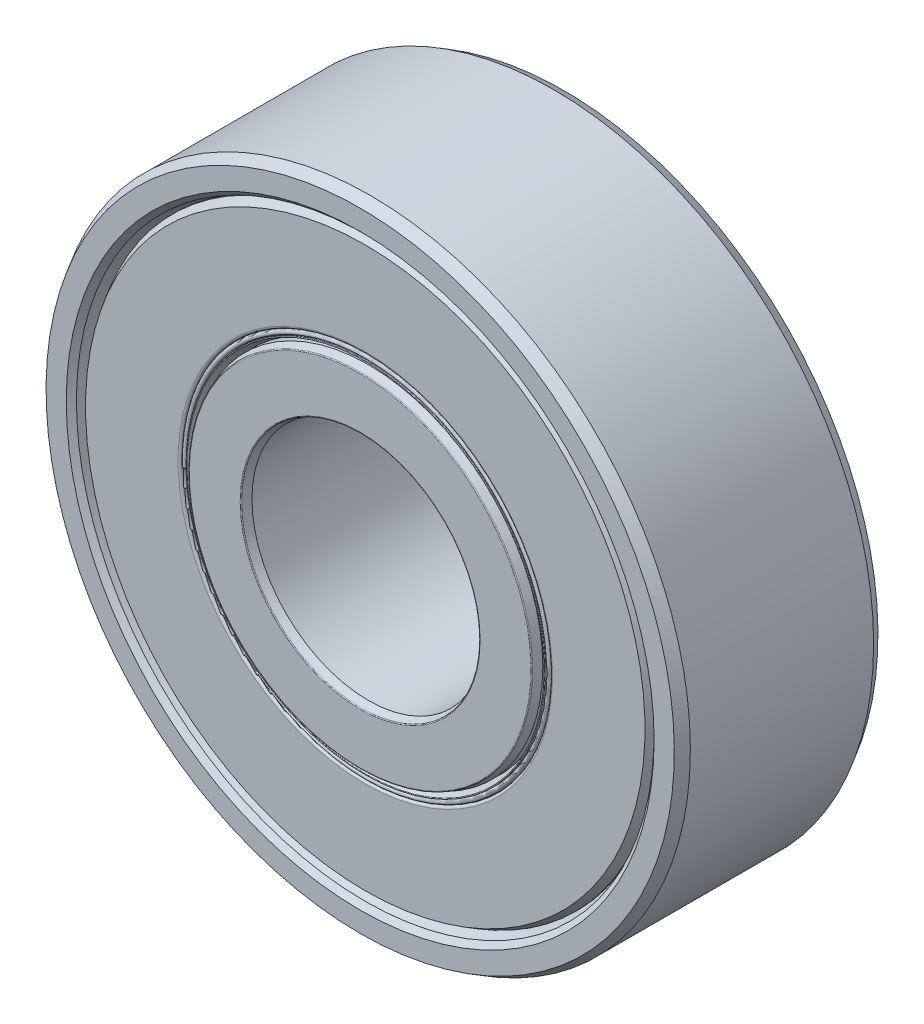
ISO-10303-21;
HEADER;
FILE_DESCRIPTION(('STEP AP214'),'2;1');
FILE_NAME('part.step','',(''),(''),'','','');
FILE_SCHEMA(('AUTOMOTIVE_DESIGN { 1 0 10303 214 1 1 1 1 }'));
ENDSEC;
DATA;
#1=APPLICATION_CONTEXT('core data for automotive mechanical design processes');
#2=APPLICATION_PROTOCOL_DEFINITION('international standard','automotive_design',2000,#1);
#3=PRODUCT_CONTEXT('',#1,'mechanical');
#4=PRODUCT('Part','Part','',(#3));
#5=PRODUCT_RELATED_PRODUCT_CATEGORY('part','',(#4));
#6=PRODUCT_DEFINITION_FORMATION('','',#4);
#7=PRODUCT_DEFINITION_CONTEXT('part definition',#1,'design');
#8=PRODUCT_DEFINITION('design','',#6,#7);
#9=PRODUCT_DEFINITION_SHAPE('','',#8);
#10=(LENGTH_UNIT() NAMED_UNIT(*) SI_UNIT(.MILLI.,.METRE.));
#11=(NAMED_UNIT(*) PLANE_ANGLE_UNIT() SI_UNIT($,.RADIAN.));
#12=(NAMED_UNIT(*) SI_UNIT($,.STERADIAN.) SOLID_ANGLE_UNIT());
#13=UNCERTAINTY_MEASURE_WITH_UNIT(LENGTH_MEASURE(1.E-05),#10,'distance_accuracy_value','');
#14=(GEOMETRIC_REPRESENTATION_CONTEXT(3) GLOBAL_UNCERTAINTY_ASSIGNED_CONTEXT((#13)) GLOBAL_UNIT_ASSIGNED_CONTEXT((#10,
#11,#12)) REPRESENTATION_CONTEXT('',''));
#15=CARTESIAN_POINT('',(0.,0.,0.));
#16=DIRECTION('',(0.,0.,1.));
#17=DIRECTION('',(1.,0.,0.));
#18=AXIS2_PLACEMENT_3D('',#15,#16,#17);
#19=CARTESIAN_POINT('',(0.,0.,3.5));
#20=DIRECTION('',(0.,0.,1.));
#21=DIRECTION('',(0.,-1.,0.));
#22=AXIS2_PLACEMENT_3D('',#19,#20,#21);
#23=CYLINDRICAL_SURFACE('',#22,6.34803966942149);
#24=CARTESIAN_POINT('',(0.,0.,-2.50098016528926));
#25=DIRECTION('',(0.,0.,1.));
#26=DIRECTION('',(0.,-1.,0.));
#27=AXIS2_PLACEMENT_3D('',#24,#25,#26);
#28=CIRCLE('',#27,6.34803966942149);
#29=CARTESIAN_POINT('',(0.,-6.34803966942148,-2.50098016528926));
#30=VERTEX_POINT('',#29);
#31=EDGE_CURVE('E11',#30,#30,#28,.T.);
#32=ORIENTED_EDGE('',*,*,#31,.F.);
#33=EDGE_LOOP('',(#32));
#34=FACE_BOUND('',#33,.T.);
#35=CARTESIAN_POINT('',(0.,0.,-3.2375));
#36=DIRECTION('',(0.,0.,1.));
#37=DIRECTION('',(0.,-1.,0.));
#38=AXIS2_PLACEMENT_3D('',#35,#36,#37);
#39=CIRCLE('',#38,6.34803966942149);
#40=CARTESIAN_POINT('',(0.,-6.34803966942149,-3.2375));
#41=VERTEX_POINT('',#40);
#42=EDGE_CURVE('E77',#41,#41,#39,.T.);
#43=ORIENTED_EDGE('',*,*,#42,.T.);
#44=EDGE_LOOP('',(#43));
#45=FACE_BOUND('',#44,.T.);
#46=ADVANCED_FACE('F52',(#34,#45),#23,.T.);
#47=CARTESIAN_POINT('',(0.,6.34803966942149,-2.50098016528926));
#48=DIRECTION('',(0.,0.,-1.));
#49=DIRECTION('',(0.,1.,0.));
#50=AXIS2_PLACEMENT_3D('',#47,#48,#49);
#51=PLANE('',#50);
#52=CARTESIAN_POINT('',(0.,0.,-2.50098016528926));
#53=DIRECTION('',(0.,0.,1.));
#54=DIRECTION('',(0.,-1.,0.));
#55=AXIS2_PLACEMENT_3D('',#52,#53,#54);
#56=CIRCLE('',#55,5.99803966942149);
#57=CARTESIAN_POINT('',(0.,-5.99803966942149,-2.50098016528926));
#58=VERTEX_POINT('',#57);
#59=EDGE_CURVE('E58',#58,#58,#56,.T.);
#60=ORIENTED_EDGE('',*,*,#59,.F.);
#61=EDGE_LOOP('',(#60));
#62=FACE_BOUND('',#61,.T.);
#63=ORIENTED_EDGE('',*,*,#31,.T.);
#64=EDGE_LOOP('',(#63));
#65=FACE_BOUND('',#64,.T.);
#66=ADVANCED_FACE('F108',(#62,#65),#51,.F.);
#67=CARTESIAN_POINT('',(0.,0.,3.5));
#68=DIRECTION('',(0.,0.,1.));
#69=DIRECTION('',(0.,-1.,0.));
#70=AXIS2_PLACEMENT_3D('',#67,#68,#69);
#71=CYLINDRICAL_SURFACE('',#70,5.99803966942149);
#72=CARTESIAN_POINT('',(0.,0.,-2.92593888343875));
#73=DIRECTION('',(0.,0.,1.));
#74=DIRECTION('',(0.,-1.,0.));
#75=AXIS2_PLACEMENT_3D('',#72,#73,#74);
#76=CIRCLE('',#75,5.99803966942149);
#77=CARTESIAN_POINT('',(0.,-5.99803966942149,-2.92593888343875));
#78=VERTEX_POINT('',#77);
#79=EDGE_CURVE('E62',#78,#78,#76,.T.);
#80=ORIENTED_EDGE('',*,*,#79,.F.);
#81=EDGE_LOOP('',(#80));
#82=FACE_BOUND('',#81,.T.);
#83=ORIENTED_EDGE('',*,*,#59,.T.);
#84=EDGE_LOOP('',(#83));
#85=FACE_BOUND('',#84,.T.);
#86=ADVANCED_FACE('F103',(#82,#85),#71,.F.);
#87=CARTESIAN_POINT('',(0.,0.,-2.92593888343875));
#88=DIRECTION('',(0.,0.,-1.));
#89=DIRECTION('',(0.,1.,0.));
#90=AXIS2_PLACEMENT_3D('',#87,#88,#89);
#91=CONICAL_SURFACE('',#90,5.99803966942149,0.349065850398868);
#92=CARTESIAN_POINT('',(0.,0.,-3.3134853525082));
#93=DIRECTION('',(0.,0.,1.));
#94=DIRECTION('',(0.,-1.,0.));
#95=AXIS2_PLACEMENT_3D('',#92,#93,#94);
#96=CIRCLE('',#95,6.13909504855773);
#97=CARTESIAN_POINT('',(0.,-6.13909504855773,-3.3134853525082));
#98=VERTEX_POINT('',#97);
#99=EDGE_CURVE('E66',#98,#98,#96,.T.);
#100=ORIENTED_EDGE('',*,*,#99,.F.);
#101=EDGE_LOOP('',(#100));
#102=FACE_BOUND('',#101,.T.);
#103=ORIENTED_EDGE('',*,*,#79,.T.);
#104=EDGE_LOOP('',(#103));
#105=FACE_BOUND('',#104,.T.);
#106=ADVANCED_FACE('F97',(#102,#105),#91,.F.);
#107=CARTESIAN_POINT('',(0.,0.,-3.3075));
#108=DIRECTION('',(0.,0.,1.));
#109=DIRECTION('',(0.,-1.,0.));
#110=AXIS2_PLACEMENT_3D('',#107,#108,#109);
#111=TOROIDAL_SURFACE('',#110,6.15553966942149,0.0174999999999998);
#112=CARTESIAN_POINT('',(0.,0.,-3.3075));
#113=DIRECTION('',(0.,0.,1.));
#114=DIRECTION('',(0.,-1.,0.));
#115=AXIS2_PLACEMENT_3D('',#112,#113,#114);
#116=CIRCLE('',#115,6.17303966942149);
#117=CARTESIAN_POINT('',(0.,-6.17303966942149,-3.3075));
#118=VERTEX_POINT('',#117);
#119=EDGE_CURVE('E71',#118,#118,#116,.T.);
#120=ORIENTED_EDGE('',*,*,#119,.F.);
#121=EDGE_LOOP('',(#120));
#122=FACE_BOUND('',#121,.T.);
#123=ORIENTED_EDGE('',*,*,#99,.T.);
#124=EDGE_LOOP('',(#123));
#125=FACE_BOUND('',#124,.T.);
#126=ADVANCED_FACE('F91',(#122,#125),#111,.T.);
#127=CARTESIAN_POINT('',(0.,0.,3.5));
#128=DIRECTION('',(0.,0.,1.));
#129=DIRECTION('',(0.,-1.,0.));
#130=AXIS2_PLACEMENT_3D('',#127,#128,#129);
#131=CYLINDRICAL_SURFACE('',#130,6.17303966942149);
#132=CARTESIAN_POINT('',(0.,0.,-3.2375));
#133=DIRECTION('',(0.,0.,1.));
#134=DIRECTION('',(0.,-1.,0.));
#135=AXIS2_PLACEMENT_3D('',#132,#133,#134);
#136=CIRCLE('',#135,6.17303966942149);
#137=CARTESIAN_POINT('',(0.,-6.17303966942149,-3.2375));
#138=VERTEX_POINT('',#137);
#139=EDGE_CURVE('E74',#138,#138,#136,.T.);
#140=ORIENTED_EDGE('',*,*,#139,.F.);
#141=EDGE_LOOP('',(#140));
#142=FACE_BOUND('',#141,.T.);
#143=ORIENTED_EDGE('',*,*,#119,.T.);
#144=EDGE_LOOP('',(#143));
#145=FACE_BOUND('',#144,.T.);
#146=ADVANCED_FACE('F85',(#142,#145),#131,.T.);
#147=CARTESIAN_POINT('',(0.,0.,-3.2375));
#148=DIRECTION('',(0.,0.,1.));
#149=DIRECTION('',(0.,-1.,0.));
#150=AXIS2_PLACEMENT_3D('',#147,#148,#149);
#151=TOROIDAL_SURFACE('',#150,6.26053966942149,0.0875000000000008);
#152=ORIENTED_EDGE('',*,*,#42,.F.);
#153=EDGE_LOOP('',(#152));
#154=FACE_BOUND('',#153,.T.);
#155=ORIENTED_EDGE('',*,*,#139,.T.);
#156=EDGE_LOOP('',(#155));
#157=FACE_BOUND('',#156,.T.);
#158=ADVANCED_FACE('F82',(#154,#157),#151,.T.);
#159=CLOSED_SHELL('',(#46,#66,#86,#106,#126,#146,#158));
#160=MANIFOLD_SOLID_BREP('B2',#159);
#161=CARTESIAN_POINT('',(0.,6.34803966942149,2.50098016528926));
#162=DIRECTION('',(0.,0.,1.));
#163=DIRECTION('',(0.,-1.,0.));
#164=AXIS2_PLACEMENT_3D('',#161,#162,#163);
#165=PLANE('',#164);
#166=CARTESIAN_POINT('',(0.,0.,2.50098016528926));
#167=DIRECTION('',(0.,0.,1.));
#168=DIRECTION('',(0.,-1.,0.));
#169=AXIS2_PLACEMENT_3D('',#166,#167,#168);
#170=CIRCLE('',#169,6.34803966942149);
#171=CARTESIAN_POINT('',(0.,-6.34803966942149,2.50098016528925));
#172=VERTEX_POINT('',#171);
#173=EDGE_CURVE('E178',#172,#172,#170,.T.);
#174=ORIENTED_EDGE('',*,*,#173,.F.);
#175=EDGE_LOOP('',(#174));
#176=FACE_BOUND('',#175,.T.);
#177=CARTESIAN_POINT('',(0.,0.,2.50098016528926));
#178=DIRECTION('',(0.,0.,1.));
#179=DIRECTION('',(0.,-1.,0.));
#180=AXIS2_PLACEMENT_3D('',#177,#178,#179);
#181=CIRCLE('',#180,5.99803966942149);
#182=CARTESIAN_POINT('',(0.,-5.99803966942149,2.50098016528925));
#183=VERTEX_POINT('',#182);
#184=EDGE_CURVE('E51',#183,#183,#181,.T.);
#185=ORIENTED_EDGE('',*,*,#184,.T.);
#186=EDGE_LOOP('',(#185));
#187=FACE_BOUND('',#186,.T.);
#188=ADVANCED_FACE('F153',(#176,#187),#165,.F.);
#189=CARTESIAN_POINT('',(0.,0.,3.5));
#190=DIRECTION('',(0.,0.,1.));
#191=DIRECTION('',(0.,-1.,0.));
#192=AXIS2_PLACEMENT_3D('',#189,#190,#191);
#193=CYLINDRICAL_SURFACE('',#192,5.99803966942149);
#194=ORIENTED_EDGE('',*,*,#184,.F.);
#195=EDGE_LOOP('',(#194));
#196=FACE_BOUND('',#195,.T.);
#197=CARTESIAN_POINT('',(0.,0.,2.92593888343875));
#198=DIRECTION('',(0.,0.,1.));
#199=DIRECTION('',(0.,-1.,0.));
#200=AXIS2_PLACEMENT_3D('',#197,#198,#199);
#201=CIRCLE('',#200,5.99803966942149);
#202=CARTESIAN_POINT('',(0.,-5.99803966942149,2.92593888343875));
#203=VERTEX_POINT('',#202);
#204=EDGE_CURVE('E159',#203,#203,#201,.T.);
#205=ORIENTED_EDGE('',*,*,#204,.T.);
#206=EDGE_LOOP('',(#205));
#207=FACE_BOUND('',#206,.T.);
#208=ADVANCED_FACE('F185',(#196,#207),#193,.F.);
#209=CARTESIAN_POINT('',(0.,0.,3.3134853525082));
#210=DIRECTION('',(0.,0.,1.));
#211=DIRECTION('',(0.,-1.,0.));
#212=AXIS2_PLACEMENT_3D('',#209,#210,#211);
#213=CONICAL_SURFACE('',#212,6.13909504855773,0.349065850398868);
#214=ORIENTED_EDGE('',*,*,#204,.F.);
#215=EDGE_LOOP('',(#214));
#216=FACE_BOUND('',#215,.T.);
#217=CARTESIAN_POINT('',(0.,0.,3.3134853525082));
#218=DIRECTION('',(0.,0.,1.));
#219=DIRECTION('',(0.,-1.,0.));
#220=AXIS2_PLACEMENT_3D('',#217,#218,#219);
#221=CIRCLE('',#220,6.13909504855773);
#222=CARTESIAN_POINT('',(0.,-6.13909504855773,3.3134853525082));
#223=VERTEX_POINT('',#222);
#224=EDGE_CURVE('E163',#223,#223,#221,.T.);
#225=ORIENTED_EDGE('',*,*,#224,.T.);
#226=EDGE_LOOP('',(#225));
#227=FACE_BOUND('',#226,.T.);
#228=ADVANCED_FACE('F189',(#216,#227),#213,.F.);
#229=CARTESIAN_POINT('',(0.,0.,3.3075));
#230=DIRECTION('',(0.,0.,1.));
#231=DIRECTION('',(0.,-1.,0.));
#232=AXIS2_PLACEMENT_3D('',#229,#230,#231);
#233=TOROIDAL_SURFACE('',#232,6.15553966942149,0.0174999999999998);
#234=ORIENTED_EDGE('',*,*,#224,.F.);
#235=EDGE_LOOP('',(#234));
#236=FACE_BOUND('',#235,.T.);
#237=CARTESIAN_POINT('',(0.,0.,3.3075));
#238=DIRECTION('',(0.,0.,1.));
#239=DIRECTION('',(0.,-1.,0.));
#240=AXIS2_PLACEMENT_3D('',#237,#238,#239);
#241=CIRCLE('',#240,6.17303966942149);
#242=CARTESIAN_POINT('',(0.,-6.17303966942149,3.3075));
#243=VERTEX_POINT('',#242);
#244=EDGE_CURVE('E167',#243,#243,#241,.T.);
#245=ORIENTED_EDGE('',*,*,#244,.T.);
#246=EDGE_LOOP('',(#245));
#247=FACE_BOUND('',#246,.T.);
#248=ADVANCED_FACE('F194',(#236,#247),#233,.T.);
#249=CARTESIAN_POINT('',(0.,0.,3.5));
#250=DIRECTION('',(0.,0.,1.));
#251=DIRECTION('',(0.,-1.,0.));
#252=AXIS2_PLACEMENT_3D('',#249,#250,#251);
#253=CYLINDRICAL_SURFACE('',#252,6.17303966942149);
#254=ORIENTED_EDGE('',*,*,#244,.F.);
#255=EDGE_LOOP('',(#254));
#256=FACE_BOUND('',#255,.T.);
#257=CARTESIAN_POINT('',(0.,0.,3.2375));
#258=DIRECTION('',(0.,0.,1.));
#259=DIRECTION('',(0.,-1.,0.));
#260=AXIS2_PLACEMENT_3D('',#257,#258,#259);
#261=CIRCLE('',#260,6.17303966942149);
#262=CARTESIAN_POINT('',(0.,-6.17303966942149,3.2375));
#263=VERTEX_POINT('',#262);
#264=EDGE_CURVE('E172',#263,#263,#261,.T.);
#265=ORIENTED_EDGE('',*,*,#264,.T.);
#266=EDGE_LOOP('',(#265));
#267=FACE_BOUND('',#266,.T.);
#268=ADVANCED_FACE('F200',(#256,#267),#253,.T.);
#269=CARTESIAN_POINT('',(0.,0.,3.2375));
#270=DIRECTION('',(0.,0.,1.));
#271=DIRECTION('',(0.,-1.,0.));
#272=AXIS2_PLACEMENT_3D('',#269,#270,#271);
#273=TOROIDAL_SURFACE('',#272,6.26053966942149,0.0875000000000008);
#274=ORIENTED_EDGE('',*,*,#264,.F.);
#275=EDGE_LOOP('',(#274));
#276=FACE_BOUND('',#275,.T.);
#277=CARTESIAN_POINT('',(0.,0.,3.2375));
#278=DIRECTION('',(0.,0.,1.));
#279=DIRECTION('',(0.,-1.,0.));
#280=AXIS2_PLACEMENT_3D('',#277,#278,#279);
#281=CIRCLE('',#280,6.34803966942149);
#282=CARTESIAN_POINT('',(0.,-6.34803966942149,3.2375));
#283=VERTEX_POINT('',#282);
#284=EDGE_CURVE('E175',#283,#283,#281,.T.);
#285=ORIENTED_EDGE('',*,*,#284,.T.);
#286=EDGE_LOOP('',(#285));
#287=FACE_BOUND('',#286,.T.);
#288=ADVANCED_FACE('F204',(#276,#287),#273,.T.);
#289=CARTESIAN_POINT('',(0.,0.,3.5));
#290=DIRECTION('',(0.,0.,1.));
#291=DIRECTION('',(0.,-1.,0.));
#292=AXIS2_PLACEMENT_3D('',#289,#290,#291);
#293=CYLINDRICAL_SURFACE('',#292,6.34803966942149);
#294=ORIENTED_EDGE('',*,*,#284,.F.);
#295=EDGE_LOOP('',(#294));
#296=FACE_BOUND('',#295,.T.);
#297=ORIENTED_EDGE('',*,*,#173,.T.);
#298=EDGE_LOOP('',(#297));
#299=FACE_BOUND('',#298,.T.);
#300=ADVANCED_FACE('F182',(#296,#299),#293,.T.);
#301=CLOSED_SHELL('',(#188,#208,#228,#248,#268,#288,#300));
#302=MANIFOLD_SOLID_BREP('B6',#301);
#303=CARTESIAN_POINT('',(0.,0.,-3.325));
#304=DIRECTION('',(0.,0.,1.));
#305=DIRECTION('',(0.,-1.,0.));
#306=AXIS2_PLACEMENT_3D('',#303,#304,#305);
#307=CONICAL_SURFACE('',#306,9.615,0.52359877559829);
#308=CARTESIAN_POINT('',(0.,0.,-3.02189110867545));
#309=DIRECTION('',(0.,0.,1.));
#310=DIRECTION('',(0.,-1.,0.));
#311=AXIS2_PLACEMENT_3D('',#308,#309,#310);
#312=CIRCLE('',#311,9.79);
#313=CARTESIAN_POINT('',(0.,-9.79,-3.02189110867545));
#314=VERTEX_POINT('',#313);
#315=EDGE_CURVE('E276',#314,#314,#312,.T.);
#316=ORIENTED_EDGE('',*,*,#315,.F.);
#317=EDGE_LOOP('',(#316));
#318=FACE_BOUND('',#317,.T.);
#319=CARTESIAN_POINT('',(0.,0.,-3.325));
#320=DIRECTION('',(0.,0.,1.));
#321=DIRECTION('',(0.,-1.,0.));
#322=AXIS2_PLACEMENT_3D('',#319,#320,#321);
#323=CIRCLE('',#322,9.615);
#324=CARTESIAN_POINT('',(0.,-9.615,-3.32500000000001));
#325=VERTEX_POINT('',#324);
#326=EDGE_CURVE('E152',#325,#325,#323,.T.);
#327=ORIENTED_EDGE('',*,*,#326,.T.);
#328=EDGE_LOOP('',(#327));
#329=FACE_BOUND('',#328,.T.);
#330=ADVANCED_FACE('F254',(#318,#329),#307,.T.);
#331=CARTESIAN_POINT('',(0.,9.615,-3.325));
#332=DIRECTION('',(0.,0.,1.));
#333=DIRECTION('',(0.,-1.,0.));
#334=AXIS2_PLACEMENT_3D('',#331,#332,#333);
#335=PLANE('',#334);
#336=ORIENTED_EDGE('',*,*,#326,.F.);
#337=EDGE_LOOP('',(#336));
#338=FACE_BOUND('',#337,.T.);
#339=CARTESIAN_POINT('',(0.,0.,-3.325));
#340=DIRECTION('',(0.,0.,1.));
#341=DIRECTION('',(0.,-1.,0.));
#342=AXIS2_PLACEMENT_3D('',#339,#340,#341);
#343=CIRCLE('',#342,6.43553966942149);
#344=CARTESIAN_POINT('',(0.,-6.43553966942149,-3.32500000000001));
#345=VERTEX_POINT('',#344);
#346=EDGE_CURVE('E260',#345,#345,#343,.T.);
#347=ORIENTED_EDGE('',*,*,#346,.T.);
#348=EDGE_LOOP('',(#347));
#349=FACE_BOUND('',#348,.T.);
#350=ADVANCED_FACE('F283',(#338,#349),#335,.F.);
#351=CARTESIAN_POINT('',(0.,0.,-3.2375));
#352=DIRECTION('',(0.,0.,1.));
#353=DIRECTION('',(0.,-1.,0.));
#354=AXIS2_PLACEMENT_3D('',#351,#352,#353);
#355=TOROIDAL_SURFACE('',#354,6.43553966942149,0.0874999999999997);
#356=ORIENTED_EDGE('',*,*,#346,.F.);
#357=EDGE_LOOP('',(#356));
#358=FACE_BOUND('',#357,.T.);
#359=CARTESIAN_POINT('',(0.,0.,-3.2375));
#360=DIRECTION('',(0.,0.,1.));
#361=DIRECTION('',(0.,-1.,0.));
#362=AXIS2_PLACEMENT_3D('',#359,#360,#361);
#363=CIRCLE('',#362,6.34803966942149);
#364=CARTESIAN_POINT('',(0.,-6.34803966942149,-3.2375));
#365=VERTEX_POINT('',#364);
#366=EDGE_CURVE('E264',#365,#365,#363,.T.);
#367=ORIENTED_EDGE('',*,*,#366,.T.);
#368=EDGE_LOOP('',(#367));
#369=FACE_BOUND('',#368,.T.);
#370=ADVANCED_FACE('F287',(#358,#369),#355,.T.);
#371=CARTESIAN_POINT('',(0.,0.,3.5));
#372=DIRECTION('',(0.,0.,1.));
#373=DIRECTION('',(0.,-1.,0.));
#374=AXIS2_PLACEMENT_3D('',#371,#372,#373);
#375=CYLINDRICAL_SURFACE('',#374,6.34803966942149);
#376=ORIENTED_EDGE('',*,*,#366,.F.);
#377=EDGE_LOOP('',(#376));
#378=FACE_BOUND('',#377,.T.);
#379=CARTESIAN_POINT('',(0.,0.,-2.50098016528926));
#380=DIRECTION('',(0.,0.,1.));
#381=DIRECTION('',(0.,-1.,0.));
#382=AXIS2_PLACEMENT_3D('',#379,#380,#381);
#383=CIRCLE('',#382,6.34803966942149);
#384=CARTESIAN_POINT('',(0.,-6.34803966942149,-2.50098016528926));
#385=VERTEX_POINT('',#384);
#386=EDGE_CURVE('E268',#385,#385,#383,.T.);
#387=ORIENTED_EDGE('',*,*,#386,.T.);
#388=EDGE_LOOP('',(#387));
#389=FACE_BOUND('',#388,.T.);
#390=ADVANCED_FACE('F292',(#378,#389),#375,.F.);
#391=CARTESIAN_POINT('',(0.,9.79,-2.50098016528926));
#392=DIRECTION('',(0.,0.,-1.));
#393=DIRECTION('',(0.,1.,0.));
#394=AXIS2_PLACEMENT_3D('',#391,#392,#393);
#395=PLANE('',#394);
#396=ORIENTED_EDGE('',*,*,#386,.F.);
#397=EDGE_LOOP('',(#396));
#398=FACE_BOUND('',#397,.T.);
#399=CARTESIAN_POINT('',(0.,0.,-2.50098016528926));
#400=DIRECTION('',(0.,0.,1.));
#401=DIRECTION('',(0.,-1.,0.));
#402=AXIS2_PLACEMENT_3D('',#399,#400,#401);
#403=CIRCLE('',#402,9.79);
#404=CARTESIAN_POINT('',(0.,-9.79,-2.50098016528926));
#405=VERTEX_POINT('',#404);
#406=EDGE_CURVE('E273',#405,#405,#403,.T.);
#407=ORIENTED_EDGE('',*,*,#406,.T.);
#408=EDGE_LOOP('',(#407));
#409=FACE_BOUND('',#408,.T.);
#410=ADVANCED_FACE('F298',(#398,#409),#395,.F.);
#411=CARTESIAN_POINT('',(0.,0.,3.5));
#412=DIRECTION('',(0.,0.,1.));
#413=DIRECTION('',(0.,-1.,0.));
#414=AXIS2_PLACEMENT_3D('',#411,#412,#413);
#415=CYLINDRICAL_SURFACE('',#414,9.79);
#416=ORIENTED_EDGE('',*,*,#406,.F.);
#417=EDGE_LOOP('',(#416));
#418=FACE_BOUND('',#417,.T.);
#419=ORIENTED_EDGE('',*,*,#315,.T.);
#420=EDGE_LOOP('',(#419));
#421=FACE_BOUND('',#420,.T.);
#422=ADVANCED_FACE('F280',(#418,#421),#415,.T.);
#423=CLOSED_SHELL('',(#330,#350,#370,#390,#410,#422));
#424=MANIFOLD_SOLID_BREP('B46',#423);
#425=CARTESIAN_POINT('',(0.,9.79,2.50098016528926));
#426=DIRECTION('',(0.,0.,1.));
#427=DIRECTION('',(0.,-1.,0.));
#428=AXIS2_PLACEMENT_3D('',#425,#426,#427);
#429=PLANE('',#428);
#430=CARTESIAN_POINT('',(0.,0.,2.50098016528925));
#431=DIRECTION('',(0.,0.,1.));
#432=DIRECTION('',(0.,-1.,0.));
#433=AXIS2_PLACEMENT_3D('',#430,#431,#432);
#434=CIRCLE('',#433,9.79);
#435=CARTESIAN_POINT('',(0.,-9.79,2.50098016528925));
#436=VERTEX_POINT('',#435);
#437=EDGE_CURVE('E253',#436,#436,#434,.T.);
#438=ORIENTED_EDGE('',*,*,#437,.F.);
#439=EDGE_LOOP('',(#438));
#440=FACE_BOUND('',#439,.T.);
#441=CARTESIAN_POINT('',(0.,0.,2.50098016528926));
#442=DIRECTION('',(0.,0.,1.));
#443=DIRECTION('',(0.,-1.,0.));
#444=AXIS2_PLACEMENT_3D('',#441,#442,#443);
#445=CIRCLE('',#444,6.34803966942149);
#446=CARTESIAN_POINT('',(0.,-6.34803966942149,2.50098016528925));
#447=VERTEX_POINT('',#446);
#448=EDGE_CURVE('E362',#447,#447,#445,.T.);
#449=ORIENTED_EDGE('',*,*,#448,.T.);
#450=EDGE_LOOP('',(#449));
#451=FACE_BOUND('',#450,.T.);
#452=ADVANCED_FACE('F340',(#440,#451),#429,.F.);
#453=CARTESIAN_POINT('',(0.,0.,3.5));
#454=DIRECTION('',(0.,0.,1.));
#455=DIRECTION('',(0.,-1.,0.));
#456=AXIS2_PLACEMENT_3D('',#453,#454,#455);
#457=CYLINDRICAL_SURFACE('',#456,9.79);
#458=CARTESIAN_POINT('',(0.,0.,3.02189110867544));
#459=DIRECTION('',(0.,0.,1.));
#460=DIRECTION('',(0.,-1.,0.));
#461=AXIS2_PLACEMENT_3D('',#458,#459,#460);
#462=CIRCLE('',#461,9.79);
#463=CARTESIAN_POINT('',(0.,-9.79,3.02189110867544));
#464=VERTEX_POINT('',#463);
#465=EDGE_CURVE('E346',#464,#464,#462,.T.);
#466=ORIENTED_EDGE('',*,*,#465,.F.);
#467=EDGE_LOOP('',(#466));
#468=FACE_BOUND('',#467,.T.);
#469=ORIENTED_EDGE('',*,*,#437,.T.);
#470=EDGE_LOOP('',(#469));
#471=FACE_BOUND('',#470,.T.);
#472=ADVANCED_FACE('F387',(#468,#471),#457,.T.);
#473=CARTESIAN_POINT('',(0.,0.,3.02189110867544));
#474=DIRECTION('',(0.,0.,-1.));
#475=DIRECTION('',(0.,1.,0.));
#476=AXIS2_PLACEMENT_3D('',#473,#474,#475);
#477=CONICAL_SURFACE('',#476,9.79,0.52359877559829);
#478=CARTESIAN_POINT('',(0.,0.,3.325));
#479=DIRECTION('',(0.,0.,1.));
#480=DIRECTION('',(0.,-1.,0.));
#481=AXIS2_PLACEMENT_3D('',#478,#479,#480);
#482=CIRCLE('',#481,9.615);
#483=CARTESIAN_POINT('',(0.,-9.615,3.325));
#484=VERTEX_POINT('',#483);
#485=EDGE_CURVE('E350',#484,#484,#482,.T.);
#486=ORIENTED_EDGE('',*,*,#485,.F.);
#487=EDGE_LOOP('',(#486));
#488=FACE_BOUND('',#487,.T.);
#489=ORIENTED_EDGE('',*,*,#465,.T.);
#490=EDGE_LOOP('',(#489));
#491=FACE_BOUND('',#490,.T.);
#492=ADVANCED_FACE('F382',(#488,#491),#477,.T.);
#493=CARTESIAN_POINT('',(0.,9.615,3.325));
#494=DIRECTION('',(0.,0.,-1.));
#495=DIRECTION('',(0.,1.,0.));
#496=AXIS2_PLACEMENT_3D('',#493,#494,#495);
#497=PLANE('',#496);
#498=CARTESIAN_POINT('',(0.,0.,3.325));
#499=DIRECTION('',(0.,0.,1.));
#500=DIRECTION('',(0.,-1.,0.));
#501=AXIS2_PLACEMENT_3D('',#498,#499,#500);
#502=CIRCLE('',#501,6.43553966942149);
#503=CARTESIAN_POINT('',(0.,-6.43553966942149,3.325));
#504=VERTEX_POINT('',#503);
#505=EDGE_CURVE('E354',#504,#504,#502,.T.);
#506=ORIENTED_EDGE('',*,*,#505,.F.);
#507=EDGE_LOOP('',(#506));
#508=FACE_BOUND('',#507,.T.);
#509=ORIENTED_EDGE('',*,*,#485,.T.);
#510=EDGE_LOOP('',(#509));
#511=FACE_BOUND('',#510,.T.);
#512=ADVANCED_FACE('F376',(#508,#511),#497,.F.);
#513=CARTESIAN_POINT('',(0.,0.,3.2375));
#514=DIRECTION('',(0.,0.,1.));
#515=DIRECTION('',(0.,-1.,0.));
#516=AXIS2_PLACEMENT_3D('',#513,#514,#515);
#517=TOROIDAL_SURFACE('',#516,6.43553966942149,0.0874999999999997);
#518=CARTESIAN_POINT('',(0.,0.,3.2375));
#519=DIRECTION('',(0.,0.,1.));
#520=DIRECTION('',(0.,-1.,0.));
#521=AXIS2_PLACEMENT_3D('',#518,#519,#520);
#522=CIRCLE('',#521,6.34803966942149);
#523=CARTESIAN_POINT('',(0.,-6.34803966942149,3.2375));
#524=VERTEX_POINT('',#523);
#525=EDGE_CURVE('E359',#524,#524,#522,.T.);
#526=ORIENTED_EDGE('',*,*,#525,.F.);
#527=EDGE_LOOP('',(#526));
#528=FACE_BOUND('',#527,.T.);
#529=ORIENTED_EDGE('',*,*,#505,.T.);
#530=EDGE_LOOP('',(#529));
#531=FACE_BOUND('',#530,.T.);
#532=ADVANCED_FACE('F370',(#528,#531),#517,.T.);
#533=CARTESIAN_POINT('',(0.,0.,3.5));
#534=DIRECTION('',(0.,0.,1.));
#535=DIRECTION('',(0.,-1.,0.));
#536=AXIS2_PLACEMENT_3D('',#533,#534,#535);
#537=CYLINDRICAL_SURFACE('',#536,6.34803966942149);
#538=ORIENTED_EDGE('',*,*,#448,.F.);
#539=EDGE_LOOP('',(#538));
#540=FACE_BOUND('',#539,.T.);
#541=ORIENTED_EDGE('',*,*,#525,.T.);
#542=EDGE_LOOP('',(#541));
#543=FACE_BOUND('',#542,.T.);
#544=ADVANCED_FACE('F367',(#540,#543),#537,.F.);
#545=CLOSED_SHELL('',(#452,#472,#492,#512,#532,#544));
#546=MANIFOLD_SOLID_BREP('B147',#545);
#547=CARTESIAN_POINT('',(-6.17179323000387,4.92184086261279,0.));
#548=DIRECTION('',(0.,0.,1.));
#549=DIRECTION('',(-0.781831482468022,0.623489801858743,0.));
#550=AXIS2_PLACEMENT_3D('',#547,#548,#549);
#551=SPHERICAL_SURFACE('',#550,2.50098016528926);
#552=CARTESIAN_POINT('',(-6.17179323000387,4.92184086261279,2.50098016528925));
#553=VERTEX_POINT('',#552);
#554=VERTEX_LOOP('',#553);
#555=FACE_BOUND('',#554,.T.);
#556=ADVANCED_FACE('F447',(#555),#551,.T.);
#557=CLOSED_SHELL('',(#556));
#558=MANIFOLD_SOLID_BREP('B248',#557);
#559=CARTESIAN_POINT('',(-7.69610027617647,-1.75658466628943,0.));
#560=DIRECTION('',(0.,0.,1.));
#561=DIRECTION('',(-0.974927912181826,-0.222520933956305,0.));
#562=AXIS2_PLACEMENT_3D('',#559,#560,#561);
#563=SPHERICAL_SURFACE('',#562,2.50098016528926);
#564=CARTESIAN_POINT('',(-7.69610027617647,-1.75658466628943,2.50098016528925));
#565=VERTEX_POINT('',#564);
#566=VERTEX_LOOP('',#565);
#567=FACE_BOUND('',#566,.T.);
#568=ADVANCED_FACE('F464',(#567),#563,.T.);
#569=CLOSED_SHELL('',(#568));
#570=MANIFOLD_SOLID_BREP('B336',#569);
#571=CARTESIAN_POINT('',(-3.42508684255252,-7.11226611367855,0.));
#572=DIRECTION('',(0.,0.,1.));
#573=DIRECTION('',(-0.433883739117565,-0.900968867902416,0.));
#574=AXIS2_PLACEMENT_3D('',#571,#572,#573);
#575=SPHERICAL_SURFACE('',#574,2.50098016528926);
#576=CARTESIAN_POINT('',(-3.42508684255252,-7.11226611367855,2.50098016528925));
#577=VERTEX_POINT('',#576);
#578=VERTEX_LOOP('',#577);
#579=FACE_BOUND('',#578,.T.);
#580=ADVANCED_FACE('F481',(#579),#575,.T.);
#581=CLOSED_SHELL('',(#580));
#582=MANIFOLD_SOLID_BREP('B443',#581);
#583=CARTESIAN_POINT('',(3.42508684255242,-7.1122661136786,0.));
#584=DIRECTION('',(0.,0.,1.));
#585=DIRECTION('',(0.433883739117553,-0.900968867902422,0.));
#586=AXIS2_PLACEMENT_3D('',#583,#584,#585);
#587=SPHERICAL_SURFACE('',#586,2.50098016528926);
#588=CARTESIAN_POINT('',(3.42508684255242,-7.1122661136786,2.50098016528925));
#589=VERTEX_POINT('',#588);
#590=VERTEX_LOOP('',#589);
#591=FACE_BOUND('',#590,.T.);
#592=ADVANCED_FACE('F498',(#591),#587,.T.);
#593=CLOSED_SHELL('',(#592));
#594=MANIFOLD_SOLID_BREP('B460',#593);
#595=CARTESIAN_POINT('',(7.69610027617644,-1.75658466628954,0.));
#596=DIRECTION('',(0.,0.,1.));
#597=DIRECTION('',(0.974927912181823,-0.222520933956318,0.));
#598=AXIS2_PLACEMENT_3D('',#595,#596,#597);
#599=SPHERICAL_SURFACE('',#598,2.50098016528926);
#600=CARTESIAN_POINT('',(7.69610027617644,-1.75658466628954,2.50098016528925));
#601=VERTEX_POINT('',#600);
#602=VERTEX_LOOP('',#601);
#603=FACE_BOUND('',#602,.T.);
#604=ADVANCED_FACE('F515',(#603),#599,.T.);
#605=CLOSED_SHELL('',(#604));
#606=MANIFOLD_SOLID_BREP('B477',#605);
#607=CARTESIAN_POINT('',(6.17179323000394,4.9218408626127,0.));
#608=DIRECTION('',(0.,0.,1.));
#609=DIRECTION('',(0.781831482468031,0.623489801858732,0.));
#610=AXIS2_PLACEMENT_3D('',#607,#608,#609);
#611=SPHERICAL_SURFACE('',#610,2.50098016528926);
#612=CARTESIAN_POINT('',(6.17179323000394,4.9218408626127,2.50098016528925));
#613=VERTEX_POINT('',#612);
#614=VERTEX_LOOP('',#613);
#615=FACE_BOUND('',#614,.T.);
#616=ADVANCED_FACE('F532',(#615),#611,.T.);
#617=CLOSED_SHELL('',(#616));
#618=MANIFOLD_SOLID_BREP('B494',#617);
#619=CARTESIAN_POINT('',(0.,7.89401983471074,0.));
#620=DIRECTION('',(0.,0.,1.));
#621=DIRECTION('',(0.,1.,0.));
#622=AXIS2_PLACEMENT_3D('',#619,#620,#621);
#623=SPHERICAL_SURFACE('',#622,2.50098016528926);
#624=CARTESIAN_POINT('',(0.,7.89401983471074,2.50098016528926));
#625=VERTEX_POINT('',#624);
#626=VERTEX_LOOP('',#625);
#627=FACE_BOUND('',#626,.T.);
#628=ADVANCED_FACE('F551',(#627),#623,.T.);
#629=CLOSED_SHELL('',(#628));
#630=MANIFOLD_SOLID_BREP('B511',#629);
#631=CARTESIAN_POINT('',(0.,0.,-3.465));
#632=DIRECTION('',(0.,0.,1.));
#633=DIRECTION('',(0.,-1.,0.));
#634=AXIS2_PLACEMENT_3D('',#631,#632,#633);
#635=TOROIDAL_SURFACE('',#634,4.12641892943188,0.0349999999999996);
#636=CARTESIAN_POINT('',(0.,0.,-3.5));
#637=DIRECTION('',(0.,0.,1.));
#638=DIRECTION('',(0.,-1.,0.));
#639=AXIS2_PLACEMENT_3D('',#636,#637,#638);
#640=CIRCLE('',#639,4.12641892943188);
#641=CARTESIAN_POINT('',(0.,-4.12641892943187,-3.5));
#642=VERTEX_POINT('',#641);
#643=EDGE_CURVE('E550',#642,#642,#640,.T.);
#644=ORIENTED_EDGE('',*,*,#643,.F.);
#645=EDGE_LOOP('',(#644));
#646=FACE_BOUND('',#645,.T.);
#647=CARTESIAN_POINT('',(0.,0.,-3.4769707050164));
#648=DIRECTION('',(0.,0.,1.));
#649=DIRECTION('',(0.,-1.,0.));
#650=AXIS2_PLACEMENT_3D('',#647,#648,#649);
#651=CIRCLE('',#650,4.09352968770437);
#652=CARTESIAN_POINT('',(0.,-4.09352968770437,-3.4769707050164));
#653=VERTEX_POINT('',#652);
#654=EDGE_CURVE('E615',#653,#653,#651,.T.);
#655=ORIENTED_EDGE('',*,*,#654,.T.);
#656=EDGE_LOOP('',(#655));
#657=FACE_BOUND('',#656,.T.);
#658=ADVANCED_FACE('F569',(#646,#657),#635,.T.);
#659=CARTESIAN_POINT('',(0.,4.12641892943188,-3.5));
#660=DIRECTION('',(0.,0.,1.));
#661=DIRECTION('',(0.,-1.,0.));
#662=AXIS2_PLACEMENT_3D('',#659,#660,#661);
#663=PLANE('',#662);
#664=CARTESIAN_POINT('',(0.,0.,-3.5));
#665=DIRECTION('',(0.,0.,1.));
#666=DIRECTION('',(0.,-1.,0.));
#667=AXIS2_PLACEMENT_3D('',#664,#665,#666);
#668=CIRCLE('',#667,5.87162073998961);
#669=CARTESIAN_POINT('',(0.,-5.87162073998961,-3.5));
#670=VERTEX_POINT('',#669);
#671=EDGE_CURVE('E575',#670,#670,#668,.T.);
#672=ORIENTED_EDGE('',*,*,#671,.F.);
#673=EDGE_LOOP('',(#672));
#674=FACE_BOUND('',#673,.T.);
#675=ORIENTED_EDGE('',*,*,#643,.T.);
#676=EDGE_LOOP('',(#675));
#677=FACE_BOUND('',#676,.T.);
#678=ADVANCED_FACE('F688',(#674,#677),#663,.F.);
#679=CARTESIAN_POINT('',(0.,0.,-3.465));
#680=DIRECTION('',(0.,0.,1.));
#681=DIRECTION('',(0.,-1.,0.));
#682=AXIS2_PLACEMENT_3D('',#679,#680,#681);
#683=TOROIDAL_SURFACE('',#682,5.87162073998961,0.0349999999999996);
#684=CARTESIAN_POINT('',(0.,0.,-3.4769707050164));
#685=DIRECTION('',(0.,0.,1.));
#686=DIRECTION('',(0.,-1.,0.));
#687=AXIS2_PLACEMENT_3D('',#684,#685,#686);
#688=CIRCLE('',#687,5.90450998171712);
#689=CARTESIAN_POINT('',(0.,-5.90450998171712,-3.4769707050164));
#690=VERTEX_POINT('',#689);
#691=EDGE_CURVE('E579',#690,#690,#688,.T.);
#692=ORIENTED_EDGE('',*,*,#691,.F.);
#693=EDGE_LOOP('',(#692));
#694=FACE_BOUND('',#693,.T.);
#695=ORIENTED_EDGE('',*,*,#671,.T.);
#696=EDGE_LOOP('',(#695));
#697=FACE_BOUND('',#696,.T.);
#698=ADVANCED_FACE('F683',(#694,#697),#683,.T.);
#699=CARTESIAN_POINT('',(0.,0.,-3.4769707050164));
#700=DIRECTION('',(0.,0.,1.));
#701=DIRECTION('',(0.,-1.,0.));
#702=AXIS2_PLACEMENT_3D('',#699,#700,#701);
#703=CONICAL_SURFACE('',#702,5.90450998171712,0.349065850398866);
#704=CARTESIAN_POINT('',(0.,0.,-3.22));
#705=DIRECTION('',(0.,0.,1.));
#706=DIRECTION('',(0.,-1.,0.));
#707=AXIS2_PLACEMENT_3D('',#704,#705,#706);
#708=CIRCLE('',#707,5.99803966942149);
#709=CARTESIAN_POINT('',(0.,-5.99803966942149,-3.22));
#710=VERTEX_POINT('',#709);
#711=EDGE_CURVE('E583',#710,#710,#708,.T.);
#712=ORIENTED_EDGE('',*,*,#711,.F.);
#713=EDGE_LOOP('',(#712));
#714=FACE_BOUND('',#713,.T.);
#715=ORIENTED_EDGE('',*,*,#691,.T.);
#716=EDGE_LOOP('',(#715));
#717=FACE_BOUND('',#716,.T.);
#718=ADVANCED_FACE('F677',(#714,#717),#703,.T.);
#719=CARTESIAN_POINT('',(0.,0.,3.5));
#720=DIRECTION('',(0.,0.,1.));
#721=DIRECTION('',(0.,-1.,0.));
#722=AXIS2_PLACEMENT_3D('',#719,#720,#721);
#723=CYLINDRICAL_SURFACE('',#722,5.99803966942149);
#724=CARTESIAN_POINT('',(0.,0.,-1.631));
#725=DIRECTION('',(0.,0.,1.));
#726=DIRECTION('',(0.,-1.,0.));
#727=AXIS2_PLACEMENT_3D('',#724,#725,#726);
#728=CIRCLE('',#727,5.99803966942149);
#729=CARTESIAN_POINT('',(0.,-5.99803966942148,-1.631));
#730=VERTEX_POINT('',#729);
#731=EDGE_CURVE('E588',#730,#730,#728,.T.);
#732=ORIENTED_EDGE('',*,*,#731,.F.);
#733=EDGE_LOOP('',(#732));
#734=FACE_BOUND('',#733,.T.);
#735=ORIENTED_EDGE('',*,*,#711,.T.);
#736=EDGE_LOOP('',(#735));
#737=FACE_BOUND('',#736,.T.);
#738=ADVANCED_FACE('F671',(#734,#737),#723,.T.);
#739=CARTESIAN_POINT('',(0.,0.,0.));
#740=DIRECTION('',(0.,0.,1.));
#741=DIRECTION('',(0.,-1.,0.));
#742=AXIS2_PLACEMENT_3D('',#739,#740,#741);
#743=TOROIDAL_SURFACE('',#742,7.89401983471074,2.50098016528926);
#744=CARTESIAN_POINT('',(0.,0.,1.631));
#745=DIRECTION('',(0.,0.,1.));
#746=DIRECTION('',(0.,-1.,0.));
#747=AXIS2_PLACEMENT_3D('',#744,#745,#746);
#748=CIRCLE('',#747,5.99803966942149);
#749=CARTESIAN_POINT('',(0.,-5.99803966942149,1.631));
#750=VERTEX_POINT('',#749);
#751=EDGE_CURVE('E591',#750,#750,#748,.T.);
#752=ORIENTED_EDGE('',*,*,#751,.F.);
#753=EDGE_LOOP('',(#752));
#754=FACE_BOUND('',#753,.T.);
#755=ORIENTED_EDGE('',*,*,#731,.T.);
#756=EDGE_LOOP('',(#755));
#757=FACE_BOUND('',#756,.T.);
#758=ADVANCED_FACE('F665',(#754,#757),#743,.F.);
#759=CARTESIAN_POINT('',(0.,0.,3.5));
#760=DIRECTION('',(0.,0.,1.));
#761=DIRECTION('',(0.,-1.,0.));
#762=AXIS2_PLACEMENT_3D('',#759,#760,#761);
#763=CYLINDRICAL_SURFACE('',#762,5.99803966942149);
#764=CARTESIAN_POINT('',(0.,0.,3.22));
#765=DIRECTION('',(0.,0.,1.));
#766=DIRECTION('',(0.,-1.,0.));
#767=AXIS2_PLACEMENT_3D('',#764,#765,#766);
#768=CIRCLE('',#767,5.99803966942149);
#769=CARTESIAN_POINT('',(0.,-5.99803966942149,3.22));
#770=VERTEX_POINT('',#769);
#771=EDGE_CURVE('E594',#770,#770,#768,.T.);
#772=ORIENTED_EDGE('',*,*,#771,.F.);
#773=EDGE_LOOP('',(#772));
#774=FACE_BOUND('',#773,.T.);
#775=ORIENTED_EDGE('',*,*,#751,.T.);
#776=EDGE_LOOP('',(#775));
#777=FACE_BOUND('',#776,.T.);
#778=ADVANCED_FACE('F659',(#774,#777),#763,.T.);
#779=CARTESIAN_POINT('',(0.,0.,3.22));
#780=DIRECTION('',(0.,0.,-1.));
#781=DIRECTION('',(0.,1.,0.));
#782=AXIS2_PLACEMENT_3D('',#779,#780,#781);
#783=CONICAL_SURFACE('',#782,5.99803966942149,0.349065850398867);
#784=CARTESIAN_POINT('',(0.,0.,3.4769707050164));
#785=DIRECTION('',(0.,0.,1.));
#786=DIRECTION('',(0.,-1.,0.));
#787=AXIS2_PLACEMENT_3D('',#784,#785,#786);
#788=CIRCLE('',#787,5.90450998171712);
#789=CARTESIAN_POINT('',(0.,-5.90450998171712,3.4769707050164));
#790=VERTEX_POINT('',#789);
#791=EDGE_CURVE('E597',#790,#790,#788,.T.);
#792=ORIENTED_EDGE('',*,*,#791,.F.);
#793=EDGE_LOOP('',(#792));
#794=FACE_BOUND('',#793,.T.);
#795=ORIENTED_EDGE('',*,*,#771,.T.);
#796=EDGE_LOOP('',(#795));
#797=FACE_BOUND('',#796,.T.);
#798=ADVANCED_FACE('F653',(#794,#797),#783,.T.);
#799=CARTESIAN_POINT('',(0.,0.,3.465));
#800=DIRECTION('',(0.,0.,1.));
#801=DIRECTION('',(0.,-1.,0.));
#802=AXIS2_PLACEMENT_3D('',#799,#800,#801);
#803=TOROIDAL_SURFACE('',#802,5.87162073998961,0.0349999999999996);
#804=CARTESIAN_POINT('',(0.,0.,3.5));
#805=DIRECTION('',(0.,0.,1.));
#806=DIRECTION('',(0.,-1.,0.));
#807=AXIS2_PLACEMENT_3D('',#804,#805,#806);
#808=CIRCLE('',#807,5.87162073998961);
#809=CARTESIAN_POINT('',(0.,-5.87162073998961,3.5));
#810=VERTEX_POINT('',#809);
#811=EDGE_CURVE('E600',#810,#810,#808,.T.);
#812=ORIENTED_EDGE('',*,*,#811,.F.);
#813=EDGE_LOOP('',(#812));
#814=FACE_BOUND('',#813,.T.);
#815=ORIENTED_EDGE('',*,*,#791,.T.);
#816=EDGE_LOOP('',(#815));
#817=FACE_BOUND('',#816,.T.);
#818=ADVANCED_FACE('F647',(#814,#817),#803,.T.);
#819=CARTESIAN_POINT('',(0.,4.12641892943188,3.5));
#820=DIRECTION('',(0.,0.,-1.));
#821=DIRECTION('',(0.,1.,0.));
#822=AXIS2_PLACEMENT_3D('',#819,#820,#821);
#823=PLANE('',#822);
#824=CARTESIAN_POINT('',(0.,0.,3.5));
#825=DIRECTION('',(0.,0.,1.));
#826=DIRECTION('',(0.,-1.,0.));
#827=AXIS2_PLACEMENT_3D('',#824,#825,#826);
#828=CIRCLE('',#827,4.12641892943188);
#829=CARTESIAN_POINT('',(0.,-4.12641892943188,3.5));
#830=VERTEX_POINT('',#829);
#831=EDGE_CURVE('E603',#830,#830,#828,.T.);
#832=ORIENTED_EDGE('',*,*,#831,.F.);
#833=EDGE_LOOP('',(#832));
#834=FACE_BOUND('',#833,.T.);
#835=ORIENTED_EDGE('',*,*,#811,.T.);
#836=EDGE_LOOP('',(#835));
#837=FACE_BOUND('',#836,.T.);
#838=ADVANCED_FACE('F641',(#834,#837),#823,.F.);
#839=CARTESIAN_POINT('',(0.,0.,3.465));
#840=DIRECTION('',(0.,0.,1.));
#841=DIRECTION('',(0.,-1.,0.));
#842=AXIS2_PLACEMENT_3D('',#839,#840,#841);
#843=TOROIDAL_SURFACE('',#842,4.12641892943188,0.0349999999999996);
#844=CARTESIAN_POINT('',(0.,0.,3.4769707050164));
#845=DIRECTION('',(0.,0.,1.));
#846=DIRECTION('',(0.,-1.,0.));
#847=AXIS2_PLACEMENT_3D('',#844,#845,#846);
#848=CIRCLE('',#847,4.09352968770437);
#849=CARTESIAN_POINT('',(0.,-4.09352968770437,3.4769707050164));
#850=VERTEX_POINT('',#849);
#851=EDGE_CURVE('E606',#850,#850,#848,.T.);
#852=ORIENTED_EDGE('',*,*,#851,.F.);
#853=EDGE_LOOP('',(#852));
#854=FACE_BOUND('',#853,.T.);
#855=ORIENTED_EDGE('',*,*,#831,.T.);
#856=EDGE_LOOP('',(#855));
#857=FACE_BOUND('',#856,.T.);
#858=ADVANCED_FACE('F635',(#854,#857),#843,.T.);
#859=CARTESIAN_POINT('',(0.,0.,3.4769707050164));
#860=DIRECTION('',(0.,0.,1.));
#861=DIRECTION('',(0.,-1.,0.));
#862=AXIS2_PLACEMENT_3D('',#859,#860,#861);
#863=CONICAL_SURFACE('',#862,4.09352968770437,0.349065850398867);
#864=CARTESIAN_POINT('',(0.,0.,3.22));
#865=DIRECTION('',(0.,0.,1.));
#866=DIRECTION('',(0.,-1.,0.));
#867=AXIS2_PLACEMENT_3D('',#864,#865,#866);
#868=CIRCLE('',#867,4.);
#869=CARTESIAN_POINT('',(0.,-4.,3.22));
#870=VERTEX_POINT('',#869);
#871=EDGE_CURVE('E609',#870,#870,#868,.T.);
#872=ORIENTED_EDGE('',*,*,#871,.F.);
#873=EDGE_LOOP('',(#872));
#874=FACE_BOUND('',#873,.T.);
#875=ORIENTED_EDGE('',*,*,#851,.T.);
#876=EDGE_LOOP('',(#875));
#877=FACE_BOUND('',#876,.T.);
#878=ADVANCED_FACE('F629',(#874,#877),#863,.F.);
#879=CARTESIAN_POINT('',(0.,0.,3.5));
#880=DIRECTION('',(0.,0.,1.));
#881=DIRECTION('',(0.,-1.,0.));
#882=AXIS2_PLACEMENT_3D('',#879,#880,#881);
#883=CYLINDRICAL_SURFACE('',#882,4.);
#884=CARTESIAN_POINT('',(0.,0.,-3.22));
#885=DIRECTION('',(0.,0.,1.));
#886=DIRECTION('',(0.,-1.,0.));
#887=AXIS2_PLACEMENT_3D('',#884,#885,#886);
#888=CIRCLE('',#887,4.);
#889=CARTESIAN_POINT('',(0.,-4.,-3.22));
#890=VERTEX_POINT('',#889);
#891=EDGE_CURVE('E612',#890,#890,#888,.T.);
#892=ORIENTED_EDGE('',*,*,#891,.F.);
#893=EDGE_LOOP('',(#892));
#894=FACE_BOUND('',#893,.T.);
#895=ORIENTED_EDGE('',*,*,#871,.T.);
#896=EDGE_LOOP('',(#895));
#897=FACE_BOUND('',#896,.T.);
#898=ADVANCED_FACE('F623',(#894,#897),#883,.F.);
#899=CARTESIAN_POINT('',(0.,0.,-3.22));
#900=DIRECTION('',(0.,0.,-1.));
#901=DIRECTION('',(0.,1.,0.));
#902=AXIS2_PLACEMENT_3D('',#899,#900,#901);
#903=CONICAL_SURFACE('',#902,4.,0.349065850398866);
#904=ORIENTED_EDGE('',*,*,#654,.F.);
#905=EDGE_LOOP('',(#904));
#906=FACE_BOUND('',#905,.T.);
#907=ORIENTED_EDGE('',*,*,#891,.T.);
#908=EDGE_LOOP('',(#907));
#909=FACE_BOUND('',#908,.T.);
#910=ADVANCED_FACE('F620',(#906,#909),#903,.F.);
#911=CLOSED_SHELL('',(#658,#678,#698,#718,#738,#758,#778,#798,#818,#838,#858,#878,#898,#910));
#912=MANIFOLD_SOLID_BREP('B528',#911);
#913=CARTESIAN_POINT('',(0.,0.,3.5));
#914=DIRECTION('',(0.,0.,1.));
#915=DIRECTION('',(0.,-1.,0.));
#916=AXIS2_PLACEMENT_3D('',#913,#914,#915);
#917=CYLINDRICAL_SURFACE('',#916,9.79);
#918=CARTESIAN_POINT('',(0.,0.,1.631));
#919=DIRECTION('',(0.,0.,1.));
#920=DIRECTION('',(0.,-1.,0.));
#921=AXIS2_PLACEMENT_3D('',#918,#919,#920);
#922=CIRCLE('',#921,9.79);
#923=CARTESIAN_POINT('',(0.,-9.79,1.631));
#924=VERTEX_POINT('',#923);
#925=EDGE_CURVE('E568',#924,#924,#922,.T.);
#926=ORIENTED_EDGE('',*,*,#925,.F.);
#927=EDGE_LOOP('',(#926));
#928=FACE_BOUND('',#927,.T.);
#929=CARTESIAN_POINT('',(0.,0.,2.94522774870363));
#930=DIRECTION('',(0.,0.,1.));
#931=DIRECTION('',(0.,-1.,0.));
#932=AXIS2_PLACEMENT_3D('',#929,#930,#931);
#933=CIRCLE('',#932,9.79);
#934=CARTESIAN_POINT('',(0.,-9.79,2.94522774870362));
#935=VERTEX_POINT('',#934);
#936=EDGE_CURVE('E804',#935,#935,#933,.T.);
#937=ORIENTED_EDGE('',*,*,#936,.T.);
#938=EDGE_LOOP('',(#937));
#939=FACE_BOUND('',#938,.T.);
#940=ADVANCED_FACE('F753',(#928,#939),#917,.F.);
#941=CARTESIAN_POINT('',(0.,0.,0.));
#942=DIRECTION('',(0.,0.,1.));
#943=DIRECTION('',(0.,-1.,0.));
#944=AXIS2_PLACEMENT_3D('',#941,#942,#943);
#945=TOROIDAL_SURFACE('',#944,7.89401983471074,2.50098016528926);
#946=CARTESIAN_POINT('',(0.,0.,-1.631));
#947=DIRECTION('',(0.,0.,1.));
#948=DIRECTION('',(0.,-1.,0.));
#949=AXIS2_PLACEMENT_3D('',#946,#947,#948);
#950=CIRCLE('',#949,9.79);
#951=CARTESIAN_POINT('',(0.,-9.79,-1.631));
#952=VERTEX_POINT('',#951);
#953=EDGE_CURVE('E760',#952,#952,#950,.T.);
#954=ORIENTED_EDGE('',*,*,#953,.F.);
#955=EDGE_LOOP('',(#954));
#956=FACE_BOUND('',#955,.T.);
#957=ORIENTED_EDGE('',*,*,#925,.T.);
#958=EDGE_LOOP('',(#957));
#959=FACE_BOUND('',#958,.T.);
#960=ADVANCED_FACE('F866',(#956,#959),#945,.F.);
#961=CARTESIAN_POINT('',(0.,0.,3.5));
#962=DIRECTION('',(0.,0.,1.));
#963=DIRECTION('',(0.,-1.,0.));
#964=AXIS2_PLACEMENT_3D('',#961,#962,#963);
#965=CYLINDRICAL_SURFACE('',#964,9.79);
#966=CARTESIAN_POINT('',(0.,0.,-2.94522774870363));
#967=DIRECTION('',(0.,0.,1.));
#968=DIRECTION('',(0.,-1.,0.));
#969=AXIS2_PLACEMENT_3D('',#966,#967,#968);
#970=CIRCLE('',#969,9.79);
#971=CARTESIAN_POINT('',(0.,-9.79,-2.94522774870363));
#972=VERTEX_POINT('',#971);
#973=EDGE_CURVE('E765',#972,#972,#970,.T.);
#974=ORIENTED_EDGE('',*,*,#973,.F.);
#975=EDGE_LOOP('',(#974));
#976=FACE_BOUND('',#975,.T.);
#977=ORIENTED_EDGE('',*,*,#953,.T.);
#978=EDGE_LOOP('',(#977));
#979=FACE_BOUND('',#978,.T.);
#980=ADVANCED_FACE('F861',(#976,#979),#965,.F.);
#981=CARTESIAN_POINT('',(0.,0.,-2.94522774870363));
#982=DIRECTION('',(0.,0.,-1.));
#983=DIRECTION('',(0.,1.,0.));
#984=AXIS2_PLACEMENT_3D('',#981,#982,#983);
#985=CONICAL_SURFACE('',#984,9.79,0.349065850398857);
#986=CARTESIAN_POINT('',(0.,0.,-3.325));
#987=DIRECTION('',(0.,0.,1.));
#988=DIRECTION('',(0.,-1.,0.));
#989=AXIS2_PLACEMENT_3D('',#986,#987,#988);
#990=CIRCLE('',#989,9.92822579527214);
#991=CARTESIAN_POINT('',(0.,-9.92822579527214,-3.325));
#992=VERTEX_POINT('',#991);
#993=EDGE_CURVE('E770',#992,#992,#990,.T.);
#994=ORIENTED_EDGE('',*,*,#993,.F.);
#995=EDGE_LOOP('',(#994));
#996=FACE_BOUND('',#995,.T.);
#997=ORIENTED_EDGE('',*,*,#973,.T.);
#998=EDGE_LOOP('',(#997));
#999=FACE_BOUND('',#998,.T.);
#1000=ADVANCED_FACE('F855',(#996,#999),#985,.F.);
#1001=CARTESIAN_POINT('',(0.,0.,-3.325));
#1002=DIRECTION('',(0.,0.,-1.));
#1003=DIRECTION('',(0.,1.,0.));
#1004=AXIS2_PLACEMENT_3D('',#1001,#1002,#1003);
#1005=CONICAL_SURFACE('',#1004,9.92822579527214,0.785398163397443);
#1006=CARTESIAN_POINT('',(0.,0.,-3.5));
#1007=DIRECTION('',(0.,0.,1.));
#1008=DIRECTION('',(0.,-1.,0.));
#1009=AXIS2_PLACEMENT_3D('',#1006,#1007,#1008);
#1010=CIRCLE('',#1009,10.1032257952721);
#1011=CARTESIAN_POINT('',(0.,-10.1032257952721,-3.50000000000001));
#1012=VERTEX_POINT('',#1011);
#1013=EDGE_CURVE('E776',#1012,#1012,#1010,.T.);
#1014=ORIENTED_EDGE('',*,*,#1013,.F.);
#1015=EDGE_LOOP('',(#1014));
#1016=FACE_BOUND('',#1015,.T.);
#1017=ORIENTED_EDGE('',*,*,#993,.T.);
#1018=EDGE_LOOP('',(#1017));
#1019=FACE_BOUND('',#1018,.T.);
#1020=ADVANCED_FACE('F849',(#1016,#1019),#1005,.F.);
#1021=CARTESIAN_POINT('',(0.,10.7979274057836,-3.5));
#1022=DIRECTION('',(0.,0.,1.));
#1023=DIRECTION('',(0.,-1.,0.));
#1024=AXIS2_PLACEMENT_3D('',#1021,#1022,#1023);
#1025=PLANE('',#1024);
#1026=CARTESIAN_POINT('',(0.,0.,-3.5));
#1027=DIRECTION('',(0.,0.,1.));
#1028=DIRECTION('',(0.,-1.,0.));
#1029=AXIS2_PLACEMENT_3D('',#1026,#1027,#1028);
#1030=CIRCLE('',#1029,10.7979274057836);
#1031=CARTESIAN_POINT('',(0.,-10.7979274057836,-3.50000000000001));
#1032=VERTEX_POINT('',#1031);
#1033=EDGE_CURVE('E780',#1032,#1032,#1030,.T.);
#1034=ORIENTED_EDGE('',*,*,#1033,.F.);
#1035=EDGE_LOOP('',(#1034));
#1036=FACE_BOUND('',#1035,.T.);
#1037=ORIENTED_EDGE('',*,*,#1013,.T.);
#1038=EDGE_LOOP('',(#1037));
#1039=FACE_BOUND('',#1038,.T.);
#1040=ADVANCED_FACE('F843',(#1036,#1039),#1025,.F.);
#1041=CARTESIAN_POINT('',(0.,0.,-3.5));
#1042=DIRECTION('',(0.,0.,1.));
#1043=DIRECTION('',(0.,-1.,0.));
#1044=AXIS2_PLACEMENT_3D('',#1041,#1042,#1043);
#1045=CONICAL_SURFACE('',#1044,10.7979274057836,0.52359877559829);
#1046=CARTESIAN_POINT('',(0.,0.,-3.15));
#1047=DIRECTION('',(0.,0.,1.));
#1048=DIRECTION('',(0.,-1.,0.));
#1049=AXIS2_PLACEMENT_3D('',#1046,#1047,#1048);
#1050=CIRCLE('',#1049,11.);
#1051=CARTESIAN_POINT('',(0.,-11.,-3.15000000000001));
#1052=VERTEX_POINT('',#1051);
#1053=EDGE_CURVE('E784',#1052,#1052,#1050,.T.);
#1054=ORIENTED_EDGE('',*,*,#1053,.F.);
#1055=EDGE_LOOP('',(#1054));
#1056=FACE_BOUND('',#1055,.T.);
#1057=ORIENTED_EDGE('',*,*,#1033,.T.);
#1058=EDGE_LOOP('',(#1057));
#1059=FACE_BOUND('',#1058,.T.);
#1060=ADVANCED_FACE('F837',(#1056,#1059),#1045,.T.);
#1061=CARTESIAN_POINT('',(0.,0.,3.5));
#1062=DIRECTION('',(0.,0.,1.));
#1063=DIRECTION('',(0.,-1.,0.));
#1064=AXIS2_PLACEMENT_3D('',#1061,#1062,#1063);
#1065=CYLINDRICAL_SURFACE('',#1064,11.);
#1066=CARTESIAN_POINT('',(0.,0.,3.15));
#1067=DIRECTION('',(0.,0.,1.));
#1068=DIRECTION('',(0.,-1.,0.));
#1069=AXIS2_PLACEMENT_3D('',#1066,#1067,#1068);
#1070=CIRCLE('',#1069,11.);
#1071=CARTESIAN_POINT('',(0.,-11.,3.15));
#1072=VERTEX_POINT('',#1071);
#1073=EDGE_CURVE('E788',#1072,#1072,#1070,.T.);
#1074=ORIENTED_EDGE('',*,*,#1073,.F.);
#1075=EDGE_LOOP('',(#1074));
#1076=FACE_BOUND('',#1075,.T.);
#1077=ORIENTED_EDGE('',*,*,#1053,.T.);
#1078=EDGE_LOOP('',(#1077));
#1079=FACE_BOUND('',#1078,.T.);
#1080=ADVANCED_FACE('F831',(#1076,#1079),#1065,.T.);
#1081=CARTESIAN_POINT('',(0.,0.,3.15));
#1082=DIRECTION('',(0.,0.,-1.));
#1083=DIRECTION('',(0.,1.,0.));
#1084=AXIS2_PLACEMENT_3D('',#1081,#1082,#1083);
#1085=CONICAL_SURFACE('',#1084,11.,0.52359877559829);
#1086=CARTESIAN_POINT('',(0.,0.,3.5));
#1087=DIRECTION('',(0.,0.,1.));
#1088=DIRECTION('',(0.,-1.,0.));
#1089=AXIS2_PLACEMENT_3D('',#1086,#1087,#1088);
#1090=CIRCLE('',#1089,10.7979274057836);
#1091=CARTESIAN_POINT('',(0.,-10.7979274057836,3.5));
#1092=VERTEX_POINT('',#1091);
#1093=EDGE_CURVE('E792',#1092,#1092,#1090,.T.);
#1094=ORIENTED_EDGE('',*,*,#1093,.F.);
#1095=EDGE_LOOP('',(#1094));
#1096=FACE_BOUND('',#1095,.T.);
#1097=ORIENTED_EDGE('',*,*,#1073,.T.);
#1098=EDGE_LOOP('',(#1097));
#1099=FACE_BOUND('',#1098,.T.);
#1100=ADVANCED_FACE('F825',(#1096,#1099),#1085,.T.);
#1101=CARTESIAN_POINT('',(0.,10.7979274057836,3.5));
#1102=DIRECTION('',(0.,0.,-1.));
#1103=DIRECTION('',(0.,1.,0.));
#1104=AXIS2_PLACEMENT_3D('',#1101,#1102,#1103);
#1105=PLANE('',#1104);
#1106=CARTESIAN_POINT('',(0.,0.,3.5));
#1107=DIRECTION('',(0.,0.,1.));
#1108=DIRECTION('',(0.,-1.,0.));
#1109=AXIS2_PLACEMENT_3D('',#1106,#1107,#1108);
#1110=CIRCLE('',#1109,10.1032257952721);
#1111=CARTESIAN_POINT('',(0.,-10.1032257952721,3.5));
#1112=VERTEX_POINT('',#1111);
#1113=EDGE_CURVE('E796',#1112,#1112,#1110,.T.);
#1114=ORIENTED_EDGE('',*,*,#1113,.F.);
#1115=EDGE_LOOP('',(#1114));
#1116=FACE_BOUND('',#1115,.T.);
#1117=ORIENTED_EDGE('',*,*,#1093,.T.);
#1118=EDGE_LOOP('',(#1117));
#1119=FACE_BOUND('',#1118,.T.);
#1120=ADVANCED_FACE('F819',(#1116,#1119),#1105,.F.);
#1121=CARTESIAN_POINT('',(0.,0.,3.5));
#1122=DIRECTION('',(0.,0.,1.));
#1123=DIRECTION('',(0.,-1.,0.));
#1124=AXIS2_PLACEMENT_3D('',#1121,#1122,#1123);
#1125=CONICAL_SURFACE('',#1124,10.1032257952721,0.785398163397445);
#1126=CARTESIAN_POINT('',(0.,0.,3.325));
#1127=DIRECTION('',(0.,0.,1.));
#1128=DIRECTION('',(0.,-1.,0.));
#1129=AXIS2_PLACEMENT_3D('',#1126,#1127,#1128);
#1130=CIRCLE('',#1129,9.92822579527214);
#1131=CARTESIAN_POINT('',(0.,-9.92822579527214,3.325));
#1132=VERTEX_POINT('',#1131);
#1133=EDGE_CURVE('E800',#1132,#1132,#1130,.T.);
#1134=ORIENTED_EDGE('',*,*,#1133,.F.);
#1135=EDGE_LOOP('',(#1134));
#1136=FACE_BOUND('',#1135,.T.);
#1137=ORIENTED_EDGE('',*,*,#1113,.T.);
#1138=EDGE_LOOP('',(#1137));
#1139=FACE_BOUND('',#1138,.T.);
#1140=ADVANCED_FACE('F813',(#1136,#1139),#1125,.F.);
#1141=CARTESIAN_POINT('',(0.,0.,3.325));
#1142=DIRECTION('',(0.,0.,1.));
#1143=DIRECTION('',(0.,-1.,0.));
#1144=AXIS2_PLACEMENT_3D('',#1141,#1142,#1143);
#1145=CONICAL_SURFACE('',#1144,9.92822579527214,0.349065850398857);
#1146=ORIENTED_EDGE('',*,*,#936,.F.);
#1147=EDGE_LOOP('',(#1146));
#1148=FACE_BOUND('',#1147,.T.);
#1149=ORIENTED_EDGE('',*,*,#1133,.T.);
#1150=EDGE_LOOP('',(#1149));
#1151=FACE_BOUND('',#1150,.T.);
#1152=ADVANCED_FACE('F810',(#1148,#1151),#1145,.F.);
#1153=CLOSED_SHELL('',(#940,#960,#980,#1000,#1020,#1040,#1060,#1080,#1100,#1120,#1140,#1152));
#1154=MANIFOLD_SOLID_BREP('B545',#1153);
#1155=ADVANCED_BREP_SHAPE_REPRESENTATION('',(#18,#160,#302,#424,#546,#558,#570,#582,#594,#606,
#618,#630,#912,#1154),#14);
#1156=SHAPE_DEFINITION_REPRESENTATION(#9,#1155);
ENDSEC;
END-ISO-10303-21;
